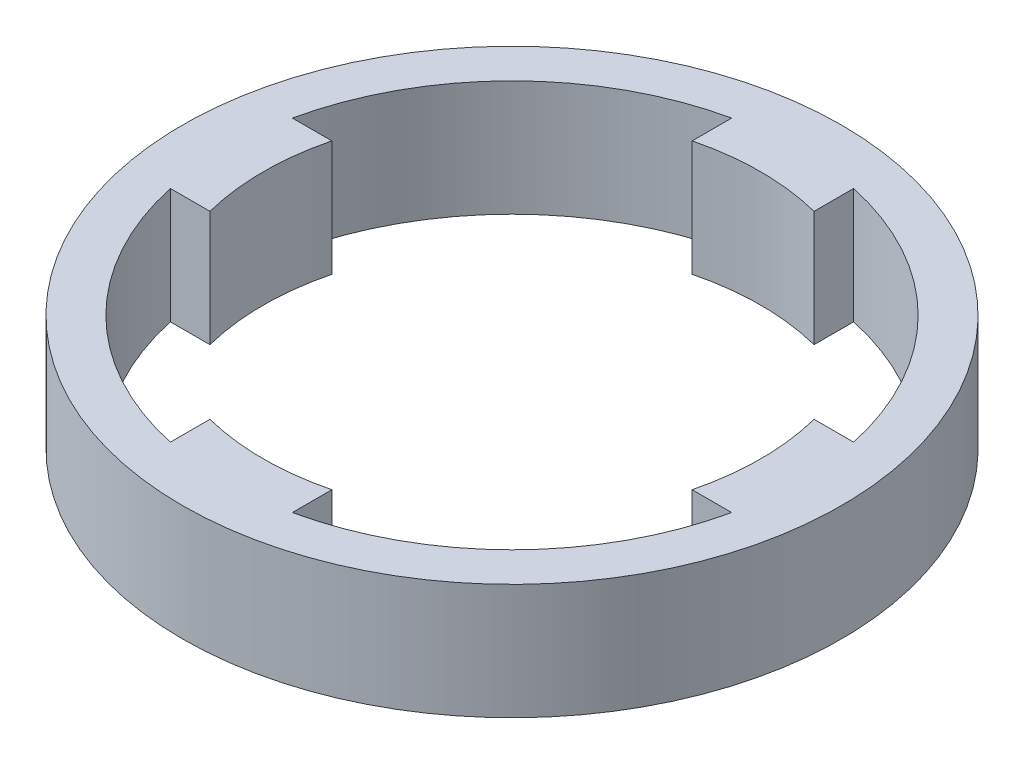
ISO-10303-21;
HEADER;
FILE_DESCRIPTION(('STEP AP214'),'2;1');
FILE_NAME('part.step','',(''),(''),'','','');
FILE_SCHEMA(('AUTOMOTIVE_DESIGN { 1 0 10303 214 1 1 1 1 }'));
ENDSEC;
DATA;
#1=APPLICATION_CONTEXT('core data for automotive mechanical design processes');
#2=APPLICATION_PROTOCOL_DEFINITION('international standard','automotive_design',2000,#1);
#3=PRODUCT_CONTEXT('',#1,'mechanical');
#4=PRODUCT('Part','Part','',(#3));
#5=PRODUCT_RELATED_PRODUCT_CATEGORY('part','',(#4));
#6=PRODUCT_DEFINITION_FORMATION('','',#4);
#7=PRODUCT_DEFINITION_CONTEXT('part definition',#1,'design');
#8=PRODUCT_DEFINITION('design','',#6,#7);
#9=PRODUCT_DEFINITION_SHAPE('','',#8);
#10=(LENGTH_UNIT() NAMED_UNIT(*) SI_UNIT(.MILLI.,.METRE.));
#11=(NAMED_UNIT(*) PLANE_ANGLE_UNIT() SI_UNIT($,.RADIAN.));
#12=(NAMED_UNIT(*) SI_UNIT($,.STERADIAN.) SOLID_ANGLE_UNIT());
#13=UNCERTAINTY_MEASURE_WITH_UNIT(LENGTH_MEASURE(1.E-05),#10,'distance_accuracy_value','');
#14=(GEOMETRIC_REPRESENTATION_CONTEXT(3) GLOBAL_UNCERTAINTY_ASSIGNED_CONTEXT((#13)) GLOBAL_UNIT_ASSIGNED_CONTEXT((#10,
#11,#12)) REPRESENTATION_CONTEXT('',''));
#15=CARTESIAN_POINT('',(0.,0.,0.));
#16=DIRECTION('',(0.,0.,1.));
#17=DIRECTION('',(1.,0.,0.));
#18=AXIS2_PLACEMENT_3D('',#15,#16,#17);
#19=CARTESIAN_POINT('',(0.,9.,0.));
#20=DIRECTION('',(0.,1.,0.));
#21=DIRECTION('',(0.,0.,1.));
#22=AXIS2_PLACEMENT_3D('',#19,#20,#21);
#23=PLANE('',#22);
#24=CARTESIAN_POINT('',(0.,9.,0.));
#25=DIRECTION('',(0.,1.,0.));
#26=DIRECTION('',(0.,0.,1.));
#27=AXIS2_PLACEMENT_3D('',#24,#25,#26);
#28=CIRCLE('',#27,25.675);
#29=CARTESIAN_POINT('',(0.,9.,25.675));
#30=VERTEX_POINT('',#29);
#31=EDGE_CURVE('E11',#30,#30,#28,.T.);
#32=ORIENTED_EDGE('',*,*,#31,.T.);
#33=EDGE_LOOP('',(#32));
#34=FACE_BOUND('',#33,.T.);
#35=DIRECTION('',(1.,0.,0.));
#36=VECTOR('',#35,1.);
#37=CARTESIAN_POINT('',(-21.8649977132402,9.,-4.75));
#38=LINE('',#37,#36);
#39=CARTESIAN_POINT('',(-21.8649977132402,9.,-4.75));
#40=VERTEX_POINT('',#39);
#41=CARTESIAN_POINT('',(-18.7837196795523,9.,-4.75));
#42=VERTEX_POINT('',#41);
#43=EDGE_CURVE('E155',#40,#42,#38,.T.);
#44=ORIENTED_EDGE('',*,*,#43,.F.);
#45=CARTESIAN_POINT('',(0.,9.,0.));
#46=DIRECTION('',(0.,1.,0.));
#47=DIRECTION('',(0.,0.,1.));
#48=AXIS2_PLACEMENT_3D('',#45,#46,#47);
#49=CIRCLE('',#48,22.375);
#50=CARTESIAN_POINT('',(-4.74999999999999,9.,-21.8649977132402));
#51=VERTEX_POINT('',#50);
#52=EDGE_CURVE('E147',#51,#40,#49,.T.);
#53=ORIENTED_EDGE('',*,*,#52,.F.);
#54=DIRECTION('',(0.,0.,-1.));
#55=VECTOR('',#54,1.);
#56=CARTESIAN_POINT('',(-4.74999999999999,9.,-21.8649977132402));
#57=LINE('',#56,#55);
#58=CARTESIAN_POINT('',(-4.74999999999999,9.,-18.7837196795523));
#59=VERTEX_POINT('',#58);
#60=EDGE_CURVE('E195',#59,#51,#57,.T.);
#61=ORIENTED_EDGE('',*,*,#60,.F.);
#62=CARTESIAN_POINT('',(0.,9.,0.));
#63=DIRECTION('',(0.,1.,0.));
#64=DIRECTION('',(0.,0.,1.));
#65=AXIS2_PLACEMENT_3D('',#62,#63,#64);
#66=CIRCLE('',#65,19.375);
#67=CARTESIAN_POINT('',(4.75,9.,-18.7837196795523));
#68=VERTEX_POINT('',#67);
#69=EDGE_CURVE('E193',#68,#59,#66,.T.);
#70=ORIENTED_EDGE('',*,*,#69,.F.);
#71=DIRECTION('',(0.,0.,1.));
#72=VECTOR('',#71,1.);
#73=CARTESIAN_POINT('',(4.75,9.,-21.8649977132402));
#74=LINE('',#73,#72);
#75=CARTESIAN_POINT('',(4.75,9.,-21.8649977132402));
#76=VERTEX_POINT('',#75);
#77=EDGE_CURVE('E191',#76,#68,#74,.T.);
#78=ORIENTED_EDGE('',*,*,#77,.F.);
#79=CARTESIAN_POINT('',(0.,9.,0.));
#80=DIRECTION('',(0.,1.,0.));
#81=DIRECTION('',(0.,0.,1.));
#82=AXIS2_PLACEMENT_3D('',#79,#80,#81);
#83=CIRCLE('',#82,22.375);
#84=CARTESIAN_POINT('',(21.8649977132402,9.,-4.75));
#85=VERTEX_POINT('',#84);
#86=EDGE_CURVE('E189',#85,#76,#83,.T.);
#87=ORIENTED_EDGE('',*,*,#86,.F.);
#88=DIRECTION('',(1.,0.,0.));
#89=VECTOR('',#88,1.);
#90=CARTESIAN_POINT('',(18.7837196795523,9.,-4.75));
#91=LINE('',#90,#89);
#92=CARTESIAN_POINT('',(18.7837196795523,9.,-4.75));
#93=VERTEX_POINT('',#92);
#94=EDGE_CURVE('E187',#93,#85,#91,.T.);
#95=ORIENTED_EDGE('',*,*,#94,.F.);
#96=CARTESIAN_POINT('',(0.,9.,0.));
#97=DIRECTION('',(0.,1.,0.));
#98=DIRECTION('',(0.,0.,1.));
#99=AXIS2_PLACEMENT_3D('',#96,#97,#98);
#100=CIRCLE('',#99,19.375);
#101=CARTESIAN_POINT('',(18.7837196795523,9.,4.75));
#102=VERTEX_POINT('',#101);
#103=EDGE_CURVE('E185',#102,#93,#100,.T.);
#104=ORIENTED_EDGE('',*,*,#103,.F.);
#105=DIRECTION('',(-1.,0.,0.));
#106=VECTOR('',#105,1.);
#107=CARTESIAN_POINT('',(21.8649977132402,9.,4.75));
#108=LINE('',#107,#106);
#109=CARTESIAN_POINT('',(21.8649977132402,9.,4.75));
#110=VERTEX_POINT('',#109);
#111=EDGE_CURVE('E183',#110,#102,#108,.T.);
#112=ORIENTED_EDGE('',*,*,#111,.F.);
#113=CARTESIAN_POINT('',(0.,9.,0.));
#114=DIRECTION('',(0.,1.,0.));
#115=DIRECTION('',(0.,0.,1.));
#116=AXIS2_PLACEMENT_3D('',#113,#114,#115);
#117=CIRCLE('',#116,22.375);
#118=CARTESIAN_POINT('',(4.75,9.,21.8649977132402));
#119=VERTEX_POINT('',#118);
#120=EDGE_CURVE('E181',#119,#110,#117,.T.);
#121=ORIENTED_EDGE('',*,*,#120,.F.);
#122=DIRECTION('',(0.,0.,1.));
#123=VECTOR('',#122,1.);
#124=CARTESIAN_POINT('',(4.75,9.,18.7837196795523));
#125=LINE('',#124,#123);
#126=CARTESIAN_POINT('',(4.75,9.,18.7837196795523));
#127=VERTEX_POINT('',#126);
#128=EDGE_CURVE('E179',#127,#119,#125,.T.);
#129=ORIENTED_EDGE('',*,*,#128,.F.);
#130=CARTESIAN_POINT('',(0.,9.,0.));
#131=DIRECTION('',(0.,1.,0.));
#132=DIRECTION('',(0.,0.,1.));
#133=AXIS2_PLACEMENT_3D('',#130,#131,#132);
#134=CIRCLE('',#133,19.375);
#135=CARTESIAN_POINT('',(-4.75000000000001,9.,18.7837196795523));
#136=VERTEX_POINT('',#135);
#137=EDGE_CURVE('E177',#136,#127,#134,.T.);
#138=ORIENTED_EDGE('',*,*,#137,.F.);
#139=DIRECTION('',(0.,0.,-1.));
#140=VECTOR('',#139,1.);
#141=CARTESIAN_POINT('',(-4.75,9.,21.8649977132402));
#142=LINE('',#141,#140);
#143=CARTESIAN_POINT('',(-4.75,9.,21.8649977132402));
#144=VERTEX_POINT('',#143);
#145=EDGE_CURVE('E175',#144,#136,#142,.T.);
#146=ORIENTED_EDGE('',*,*,#145,.F.);
#147=CARTESIAN_POINT('',(0.,9.,0.));
#148=DIRECTION('',(0.,1.,0.));
#149=DIRECTION('',(0.,0.,1.));
#150=AXIS2_PLACEMENT_3D('',#147,#148,#149);
#151=CIRCLE('',#150,22.375);
#152=CARTESIAN_POINT('',(-21.8649977132402,9.,4.75));
#153=VERTEX_POINT('',#152);
#154=EDGE_CURVE('E173',#153,#144,#151,.T.);
#155=ORIENTED_EDGE('',*,*,#154,.F.);
#156=DIRECTION('',(-1.,0.,0.));
#157=VECTOR('',#156,1.);
#158=CARTESIAN_POINT('',(-18.7837196795523,9.,4.75));
#159=LINE('',#158,#157);
#160=CARTESIAN_POINT('',(-18.7837196795523,9.,4.75));
#161=VERTEX_POINT('',#160);
#162=EDGE_CURVE('E169',#161,#153,#159,.T.);
#163=ORIENTED_EDGE('',*,*,#162,.F.);
#164=CARTESIAN_POINT('',(0.,9.,0.));
#165=DIRECTION('',(0.,1.,0.));
#166=DIRECTION('',(0.,0.,1.));
#167=AXIS2_PLACEMENT_3D('',#164,#165,#166);
#168=CIRCLE('',#167,19.375);
#169=EDGE_CURVE('E167',#42,#161,#168,.T.);
#170=ORIENTED_EDGE('',*,*,#169,.F.);
#171=EDGE_LOOP('',(#44,#53,#61,#70,#78,#87,#95,#104,#112,#121,#129,#138,#146,#155,#163,#170));
#172=FACE_BOUND('',#171,.T.);
#173=ADVANCED_FACE('F34',(#34,#172),#23,.T.);
#174=CARTESIAN_POINT('',(0.,0.,0.));
#175=DIRECTION('',(0.,1.,0.));
#176=DIRECTION('',(0.,0.,1.));
#177=AXIS2_PLACEMENT_3D('',#174,#175,#176);
#178=PLANE('',#177);
#179=CARTESIAN_POINT('',(0.,0.,0.));
#180=DIRECTION('',(0.,1.,0.));
#181=DIRECTION('',(0.,0.,1.));
#182=AXIS2_PLACEMENT_3D('',#179,#180,#181);
#183=CIRCLE('',#182,25.675);
#184=CARTESIAN_POINT('',(0.,0.,25.675));
#185=VERTEX_POINT('',#184);
#186=EDGE_CURVE('E38',#185,#185,#183,.T.);
#187=ORIENTED_EDGE('',*,*,#186,.F.);
#188=EDGE_LOOP('',(#187));
#189=FACE_BOUND('',#188,.T.);
#190=CARTESIAN_POINT('',(0.,0.,0.));
#191=DIRECTION('',(0.,1.,0.));
#192=DIRECTION('',(0.,0.,1.));
#193=AXIS2_PLACEMENT_3D('',#190,#191,#192);
#194=CIRCLE('',#193,22.375);
#195=CARTESIAN_POINT('',(-4.74999999999999,0.,-21.8649977132402));
#196=VERTEX_POINT('',#195);
#197=CARTESIAN_POINT('',(-21.8649977132402,0.,-4.75));
#198=VERTEX_POINT('',#197);
#199=EDGE_CURVE('E57',#196,#198,#194,.T.);
#200=ORIENTED_EDGE('',*,*,#199,.T.);
#201=DIRECTION('',(1.,0.,0.));
#202=VECTOR('',#201,1.);
#203=CARTESIAN_POINT('',(-21.8649977132402,0.,-4.75));
#204=LINE('',#203,#202);
#205=CARTESIAN_POINT('',(-18.7837196795523,0.,-4.75));
#206=VERTEX_POINT('',#205);
#207=EDGE_CURVE('E162',#198,#206,#204,.T.);
#208=ORIENTED_EDGE('',*,*,#207,.T.);
#209=CARTESIAN_POINT('',(0.,0.,0.));
#210=DIRECTION('',(0.,1.,0.));
#211=DIRECTION('',(0.,0.,1.));
#212=AXIS2_PLACEMENT_3D('',#209,#210,#211);
#213=CIRCLE('',#212,19.375);
#214=CARTESIAN_POINT('',(-18.7837196795523,0.,4.75));
#215=VERTEX_POINT('',#214);
#216=EDGE_CURVE('E199',#206,#215,#213,.T.);
#217=ORIENTED_EDGE('',*,*,#216,.T.);
#218=DIRECTION('',(-1.,0.,0.));
#219=VECTOR('',#218,1.);
#220=CARTESIAN_POINT('',(-18.7837196795523,0.,4.75));
#221=LINE('',#220,#219);
#222=CARTESIAN_POINT('',(-21.8649977132402,0.,4.75));
#223=VERTEX_POINT('',#222);
#224=EDGE_CURVE('E202',#215,#223,#221,.T.);
#225=ORIENTED_EDGE('',*,*,#224,.T.);
#226=CARTESIAN_POINT('',(0.,0.,0.));
#227=DIRECTION('',(0.,1.,0.));
#228=DIRECTION('',(0.,0.,1.));
#229=AXIS2_PLACEMENT_3D('',#226,#227,#228);
#230=CIRCLE('',#229,22.375);
#231=CARTESIAN_POINT('',(-4.75,0.,21.8649977132402));
#232=VERTEX_POINT('',#231);
#233=EDGE_CURVE('E205',#223,#232,#230,.T.);
#234=ORIENTED_EDGE('',*,*,#233,.T.);
#235=DIRECTION('',(0.,0.,-1.));
#236=VECTOR('',#235,1.);
#237=CARTESIAN_POINT('',(-4.75,0.,21.8649977132402));
#238=LINE('',#237,#236);
#239=CARTESIAN_POINT('',(-4.75000000000001,0.,18.7837196795523));
#240=VERTEX_POINT('',#239);
#241=EDGE_CURVE('E208',#232,#240,#238,.T.);
#242=ORIENTED_EDGE('',*,*,#241,.T.);
#243=CARTESIAN_POINT('',(0.,0.,0.));
#244=DIRECTION('',(0.,1.,0.));
#245=DIRECTION('',(0.,0.,1.));
#246=AXIS2_PLACEMENT_3D('',#243,#244,#245);
#247=CIRCLE('',#246,19.375);
#248=CARTESIAN_POINT('',(4.75,0.,18.7837196795523));
#249=VERTEX_POINT('',#248);
#250=EDGE_CURVE('E211',#240,#249,#247,.T.);
#251=ORIENTED_EDGE('',*,*,#250,.T.);
#252=DIRECTION('',(0.,0.,1.));
#253=VECTOR('',#252,1.);
#254=CARTESIAN_POINT('',(4.75,0.,18.7837196795523));
#255=LINE('',#254,#253);
#256=CARTESIAN_POINT('',(4.75,0.,21.8649977132402));
#257=VERTEX_POINT('',#256);
#258=EDGE_CURVE('E214',#249,#257,#255,.T.);
#259=ORIENTED_EDGE('',*,*,#258,.T.);
#260=CARTESIAN_POINT('',(0.,0.,0.));
#261=DIRECTION('',(0.,1.,0.));
#262=DIRECTION('',(0.,0.,1.));
#263=AXIS2_PLACEMENT_3D('',#260,#261,#262);
#264=CIRCLE('',#263,22.375);
#265=CARTESIAN_POINT('',(21.8649977132402,0.,4.75));
#266=VERTEX_POINT('',#265);
#267=EDGE_CURVE('E217',#257,#266,#264,.T.);
#268=ORIENTED_EDGE('',*,*,#267,.T.);
#269=DIRECTION('',(-1.,0.,0.));
#270=VECTOR('',#269,1.);
#271=CARTESIAN_POINT('',(21.8649977132402,0.,4.75));
#272=LINE('',#271,#270);
#273=CARTESIAN_POINT('',(18.7837196795523,0.,4.75));
#274=VERTEX_POINT('',#273);
#275=EDGE_CURVE('E220',#266,#274,#272,.T.);
#276=ORIENTED_EDGE('',*,*,#275,.T.);
#277=CARTESIAN_POINT('',(0.,0.,0.));
#278=DIRECTION('',(0.,1.,0.));
#279=DIRECTION('',(0.,0.,1.));
#280=AXIS2_PLACEMENT_3D('',#277,#278,#279);
#281=CIRCLE('',#280,19.375);
#282=CARTESIAN_POINT('',(18.7837196795523,0.,-4.75));
#283=VERTEX_POINT('',#282);
#284=EDGE_CURVE('E223',#274,#283,#281,.T.);
#285=ORIENTED_EDGE('',*,*,#284,.T.);
#286=DIRECTION('',(1.,0.,0.));
#287=VECTOR('',#286,1.);
#288=CARTESIAN_POINT('',(18.7837196795523,0.,-4.75));
#289=LINE('',#288,#287);
#290=CARTESIAN_POINT('',(21.8649977132402,0.,-4.75));
#291=VERTEX_POINT('',#290);
#292=EDGE_CURVE('E226',#283,#291,#289,.T.);
#293=ORIENTED_EDGE('',*,*,#292,.T.);
#294=CARTESIAN_POINT('',(0.,0.,0.));
#295=DIRECTION('',(0.,1.,0.));
#296=DIRECTION('',(0.,0.,1.));
#297=AXIS2_PLACEMENT_3D('',#294,#295,#296);
#298=CIRCLE('',#297,22.375);
#299=CARTESIAN_POINT('',(4.75,0.,-21.8649977132402));
#300=VERTEX_POINT('',#299);
#301=EDGE_CURVE('E229',#291,#300,#298,.T.);
#302=ORIENTED_EDGE('',*,*,#301,.T.);
#303=DIRECTION('',(0.,0.,1.));
#304=VECTOR('',#303,1.);
#305=CARTESIAN_POINT('',(4.75,0.,-21.8649977132402));
#306=LINE('',#305,#304);
#307=CARTESIAN_POINT('',(4.75,0.,-18.7837196795523));
#308=VERTEX_POINT('',#307);
#309=EDGE_CURVE('E232',#300,#308,#306,.T.);
#310=ORIENTED_EDGE('',*,*,#309,.T.);
#311=CARTESIAN_POINT('',(0.,0.,0.));
#312=DIRECTION('',(0.,1.,0.));
#313=DIRECTION('',(0.,0.,1.));
#314=AXIS2_PLACEMENT_3D('',#311,#312,#313);
#315=CIRCLE('',#314,19.375);
#316=CARTESIAN_POINT('',(-4.74999999999999,0.,-18.7837196795523));
#317=VERTEX_POINT('',#316);
#318=EDGE_CURVE('E235',#308,#317,#315,.T.);
#319=ORIENTED_EDGE('',*,*,#318,.T.);
#320=DIRECTION('',(0.,0.,-1.));
#321=VECTOR('',#320,1.);
#322=CARTESIAN_POINT('',(-4.74999999999999,0.,-21.8649977132402));
#323=LINE('',#322,#321);
#324=EDGE_CURVE('E156',#317,#196,#323,.T.);
#325=ORIENTED_EDGE('',*,*,#324,.T.);
#326=EDGE_LOOP('',(#200,#208,#217,#225,#234,#242,#251,#259,#268,#276,#285,#293,#302,#310,#319,#325));
#327=FACE_BOUND('',#326,.T.);
#328=ADVANCED_FACE('F272',(#189,#327),#178,.F.);
#329=CARTESIAN_POINT('',(0.,9.,0.));
#330=DIRECTION('',(0.,-1.,0.));
#331=DIRECTION('',(0.,0.,-1.));
#332=AXIS2_PLACEMENT_3D('',#329,#330,#331);
#333=CYLINDRICAL_SURFACE('',#332,25.675);
#334=ORIENTED_EDGE('',*,*,#31,.F.);
#335=EDGE_LOOP('',(#334));
#336=FACE_BOUND('',#335,.T.);
#337=ORIENTED_EDGE('',*,*,#186,.T.);
#338=EDGE_LOOP('',(#337));
#339=FACE_BOUND('',#338,.T.);
#340=ADVANCED_FACE('F36',(#336,#339),#333,.T.);
#341=CARTESIAN_POINT('',(0.,9.,0.));
#342=DIRECTION('',(0.,-1.,0.));
#343=DIRECTION('',(0.,0.,-1.));
#344=AXIS2_PLACEMENT_3D('',#341,#342,#343);
#345=CYLINDRICAL_SURFACE('',#344,22.375);
#346=ORIENTED_EDGE('',*,*,#199,.F.);
#347=DIRECTION('',(0.,-1.,0.));
#348=VECTOR('',#347,1.);
#349=CARTESIAN_POINT('',(-4.74999999999999,9.,-21.8649977132402));
#350=LINE('',#349,#348);
#351=EDGE_CURVE('E151',#51,#196,#350,.T.);
#352=ORIENTED_EDGE('',*,*,#351,.F.);
#353=ORIENTED_EDGE('',*,*,#52,.T.);
#354=DIRECTION('',(0.,-1.,0.));
#355=VECTOR('',#354,1.);
#356=CARTESIAN_POINT('',(-21.8649977132402,9.,-4.75));
#357=LINE('',#356,#355);
#358=EDGE_CURVE('E150',#40,#198,#357,.T.);
#359=ORIENTED_EDGE('',*,*,#358,.T.);
#360=EDGE_LOOP('',(#346,#352,#353,#359));
#361=FACE_BOUND('',#360,.T.);
#362=ADVANCED_FACE('F149',(#361),#345,.F.);
#363=CARTESIAN_POINT('',(-21.8649977132402,9.,-4.75));
#364=DIRECTION('',(0.,0.,-1.));
#365=DIRECTION('',(-1.,0.,0.));
#366=AXIS2_PLACEMENT_3D('',#363,#364,#365);
#367=PLANE('',#366);
#368=ORIENTED_EDGE('',*,*,#207,.F.);
#369=ORIENTED_EDGE('',*,*,#358,.F.);
#370=ORIENTED_EDGE('',*,*,#43,.T.);
#371=DIRECTION('',(0.,-1.,0.));
#372=VECTOR('',#371,1.);
#373=CARTESIAN_POINT('',(-18.7837196795523,9.,-4.75));
#374=LINE('',#373,#372);
#375=EDGE_CURVE('E163',#42,#206,#374,.T.);
#376=ORIENTED_EDGE('',*,*,#375,.T.);
#377=EDGE_LOOP('',(#368,#369,#370,#376));
#378=FACE_BOUND('',#377,.T.);
#379=ADVANCED_FACE('F159',(#378),#367,.T.);
#380=CARTESIAN_POINT('',(0.,9.,0.));
#381=DIRECTION('',(0.,-1.,0.));
#382=DIRECTION('',(0.,0.,-1.));
#383=AXIS2_PLACEMENT_3D('',#380,#381,#382);
#384=CYLINDRICAL_SURFACE('',#383,19.375);
#385=ORIENTED_EDGE('',*,*,#216,.F.);
#386=ORIENTED_EDGE('',*,*,#375,.F.);
#387=ORIENTED_EDGE('',*,*,#169,.T.);
#388=DIRECTION('',(0.,-1.,0.));
#389=VECTOR('',#388,1.);
#390=CARTESIAN_POINT('',(-18.7837196795523,9.,4.75));
#391=LINE('',#390,#389);
#392=EDGE_CURVE('E264',#161,#215,#391,.T.);
#393=ORIENTED_EDGE('',*,*,#392,.T.);
#394=EDGE_LOOP('',(#385,#386,#387,#393));
#395=FACE_BOUND('',#394,.T.);
#396=ADVANCED_FACE('F268',(#395),#384,.F.);
#397=CARTESIAN_POINT('',(-18.7837196795523,9.,4.75));
#398=DIRECTION('',(0.,0.,1.));
#399=DIRECTION('',(1.,0.,0.));
#400=AXIS2_PLACEMENT_3D('',#397,#398,#399);
#401=PLANE('',#400);
#402=ORIENTED_EDGE('',*,*,#224,.F.);
#403=ORIENTED_EDGE('',*,*,#392,.F.);
#404=ORIENTED_EDGE('',*,*,#162,.T.);
#405=DIRECTION('',(0.,-1.,0.));
#406=VECTOR('',#405,1.);
#407=CARTESIAN_POINT('',(-21.8649977132402,9.,4.75));
#408=LINE('',#407,#406);
#409=EDGE_CURVE('E262',#153,#223,#408,.T.);
#410=ORIENTED_EDGE('',*,*,#409,.T.);
#411=EDGE_LOOP('',(#402,#403,#404,#410));
#412=FACE_BOUND('',#411,.T.);
#413=ADVANCED_FACE('F330',(#412),#401,.T.);
#414=CARTESIAN_POINT('',(0.,9.,0.));
#415=DIRECTION('',(0.,-1.,0.));
#416=DIRECTION('',(0.,0.,-1.));
#417=AXIS2_PLACEMENT_3D('',#414,#415,#416);
#418=CYLINDRICAL_SURFACE('',#417,22.375);
#419=ORIENTED_EDGE('',*,*,#233,.F.);
#420=ORIENTED_EDGE('',*,*,#409,.F.);
#421=ORIENTED_EDGE('',*,*,#154,.T.);
#422=DIRECTION('',(0.,-1.,0.));
#423=VECTOR('',#422,1.);
#424=CARTESIAN_POINT('',(-4.75,9.,21.8649977132402));
#425=LINE('',#424,#423);
#426=EDGE_CURVE('E260',#144,#232,#425,.T.);
#427=ORIENTED_EDGE('',*,*,#426,.T.);
#428=EDGE_LOOP('',(#419,#420,#421,#427));
#429=FACE_BOUND('',#428,.T.);
#430=ADVANCED_FACE('F327',(#429),#418,.F.);
#431=CARTESIAN_POINT('',(-4.75,9.,21.8649977132402));
#432=DIRECTION('',(-1.,0.,0.));
#433=DIRECTION('',(0.,0.,1.));
#434=AXIS2_PLACEMENT_3D('',#431,#432,#433);
#435=PLANE('',#434);
#436=ORIENTED_EDGE('',*,*,#241,.F.);
#437=ORIENTED_EDGE('',*,*,#426,.F.);
#438=ORIENTED_EDGE('',*,*,#145,.T.);
#439=DIRECTION('',(0.,-1.,0.));
#440=VECTOR('',#439,1.);
#441=CARTESIAN_POINT('',(-4.75000000000001,9.,18.7837196795523));
#442=LINE('',#441,#440);
#443=EDGE_CURVE('E258',#136,#240,#442,.T.);
#444=ORIENTED_EDGE('',*,*,#443,.T.);
#445=EDGE_LOOP('',(#436,#437,#438,#444));
#446=FACE_BOUND('',#445,.T.);
#447=ADVANCED_FACE('F324',(#446),#435,.T.);
#448=CARTESIAN_POINT('',(0.,9.,0.));
#449=DIRECTION('',(0.,-1.,0.));
#450=DIRECTION('',(0.,0.,-1.));
#451=AXIS2_PLACEMENT_3D('',#448,#449,#450);
#452=CYLINDRICAL_SURFACE('',#451,19.375);
#453=ORIENTED_EDGE('',*,*,#250,.F.);
#454=ORIENTED_EDGE('',*,*,#443,.F.);
#455=ORIENTED_EDGE('',*,*,#137,.T.);
#456=DIRECTION('',(0.,-1.,0.));
#457=VECTOR('',#456,1.);
#458=CARTESIAN_POINT('',(4.75,9.,18.7837196795523));
#459=LINE('',#458,#457);
#460=EDGE_CURVE('E256',#127,#249,#459,.T.);
#461=ORIENTED_EDGE('',*,*,#460,.T.);
#462=EDGE_LOOP('',(#453,#454,#455,#461));
#463=FACE_BOUND('',#462,.T.);
#464=ADVANCED_FACE('F317',(#463),#452,.F.);
#465=CARTESIAN_POINT('',(4.75,9.,18.7837196795523));
#466=DIRECTION('',(1.,0.,0.));
#467=DIRECTION('',(0.,0.,-1.));
#468=AXIS2_PLACEMENT_3D('',#465,#466,#467);
#469=PLANE('',#468);
#470=ORIENTED_EDGE('',*,*,#258,.F.);
#471=ORIENTED_EDGE('',*,*,#460,.F.);
#472=ORIENTED_EDGE('',*,*,#128,.T.);
#473=DIRECTION('',(0.,-1.,0.));
#474=VECTOR('',#473,1.);
#475=CARTESIAN_POINT('',(4.75,9.,21.8649977132402));
#476=LINE('',#475,#474);
#477=EDGE_CURVE('E254',#119,#257,#476,.T.);
#478=ORIENTED_EDGE('',*,*,#477,.T.);
#479=EDGE_LOOP('',(#470,#471,#472,#478));
#480=FACE_BOUND('',#479,.T.);
#481=ADVANCED_FACE('F313',(#480),#469,.T.);
#482=CARTESIAN_POINT('',(0.,9.,0.));
#483=DIRECTION('',(0.,-1.,0.));
#484=DIRECTION('',(0.,0.,-1.));
#485=AXIS2_PLACEMENT_3D('',#482,#483,#484);
#486=CYLINDRICAL_SURFACE('',#485,22.375);
#487=ORIENTED_EDGE('',*,*,#267,.F.);
#488=ORIENTED_EDGE('',*,*,#477,.F.);
#489=ORIENTED_EDGE('',*,*,#120,.T.);
#490=DIRECTION('',(0.,-1.,0.));
#491=VECTOR('',#490,1.);
#492=CARTESIAN_POINT('',(21.8649977132402,9.,4.75));
#493=LINE('',#492,#491);
#494=EDGE_CURVE('E252',#110,#266,#493,.T.);
#495=ORIENTED_EDGE('',*,*,#494,.T.);
#496=EDGE_LOOP('',(#487,#488,#489,#495));
#497=FACE_BOUND('',#496,.T.);
#498=ADVANCED_FACE('F310',(#497),#486,.F.);
#499=CARTESIAN_POINT('',(21.8649977132402,9.,4.75));
#500=DIRECTION('',(0.,0.,1.));
#501=DIRECTION('',(1.,0.,0.));
#502=AXIS2_PLACEMENT_3D('',#499,#500,#501);
#503=PLANE('',#502);
#504=ORIENTED_EDGE('',*,*,#275,.F.);
#505=ORIENTED_EDGE('',*,*,#494,.F.);
#506=ORIENTED_EDGE('',*,*,#111,.T.);
#507=DIRECTION('',(0.,-1.,0.));
#508=VECTOR('',#507,1.);
#509=CARTESIAN_POINT('',(18.7837196795523,9.,4.75));
#510=LINE('',#509,#508);
#511=EDGE_CURVE('E250',#102,#274,#510,.T.);
#512=ORIENTED_EDGE('',*,*,#511,.T.);
#513=EDGE_LOOP('',(#504,#505,#506,#512));
#514=FACE_BOUND('',#513,.T.);
#515=ADVANCED_FACE('F302',(#514),#503,.T.);
#516=CARTESIAN_POINT('',(0.,9.,0.));
#517=DIRECTION('',(0.,-1.,0.));
#518=DIRECTION('',(0.,0.,-1.));
#519=AXIS2_PLACEMENT_3D('',#516,#517,#518);
#520=CYLINDRICAL_SURFACE('',#519,19.375);
#521=ORIENTED_EDGE('',*,*,#284,.F.);
#522=ORIENTED_EDGE('',*,*,#511,.F.);
#523=ORIENTED_EDGE('',*,*,#103,.T.);
#524=DIRECTION('',(0.,-1.,0.));
#525=VECTOR('',#524,1.);
#526=CARTESIAN_POINT('',(18.7837196795523,9.,-4.75));
#527=LINE('',#526,#525);
#528=EDGE_CURVE('E248',#93,#283,#527,.T.);
#529=ORIENTED_EDGE('',*,*,#528,.T.);
#530=EDGE_LOOP('',(#521,#522,#523,#529));
#531=FACE_BOUND('',#530,.T.);
#532=ADVANCED_FACE('F298',(#531),#520,.F.);
#533=CARTESIAN_POINT('',(18.7837196795523,9.,-4.75));
#534=DIRECTION('',(0.,0.,-1.));
#535=DIRECTION('',(-1.,0.,0.));
#536=AXIS2_PLACEMENT_3D('',#533,#534,#535);
#537=PLANE('',#536);
#538=ORIENTED_EDGE('',*,*,#292,.F.);
#539=ORIENTED_EDGE('',*,*,#528,.F.);
#540=ORIENTED_EDGE('',*,*,#94,.T.);
#541=DIRECTION('',(0.,-1.,0.));
#542=VECTOR('',#541,1.);
#543=CARTESIAN_POINT('',(21.8649977132402,9.,-4.75));
#544=LINE('',#543,#542);
#545=EDGE_CURVE('E246',#85,#291,#544,.T.);
#546=ORIENTED_EDGE('',*,*,#545,.T.);
#547=EDGE_LOOP('',(#538,#539,#540,#546));
#548=FACE_BOUND('',#547,.T.);
#549=ADVANCED_FACE('F295',(#548),#537,.T.);
#550=CARTESIAN_POINT('',(0.,9.,0.));
#551=DIRECTION('',(0.,-1.,0.));
#552=DIRECTION('',(0.,0.,-1.));
#553=AXIS2_PLACEMENT_3D('',#550,#551,#552);
#554=CYLINDRICAL_SURFACE('',#553,22.375);
#555=ORIENTED_EDGE('',*,*,#301,.F.);
#556=ORIENTED_EDGE('',*,*,#545,.F.);
#557=ORIENTED_EDGE('',*,*,#86,.T.);
#558=DIRECTION('',(0.,-1.,0.));
#559=VECTOR('',#558,1.);
#560=CARTESIAN_POINT('',(4.75,9.,-21.8649977132402));
#561=LINE('',#560,#559);
#562=EDGE_CURVE('E244',#76,#300,#561,.T.);
#563=ORIENTED_EDGE('',*,*,#562,.T.);
#564=EDGE_LOOP('',(#555,#556,#557,#563));
#565=FACE_BOUND('',#564,.T.);
#566=ADVANCED_FACE('F287',(#565),#554,.F.);
#567=CARTESIAN_POINT('',(4.75,9.,-21.8649977132402));
#568=DIRECTION('',(1.,0.,0.));
#569=DIRECTION('',(0.,0.,-1.));
#570=AXIS2_PLACEMENT_3D('',#567,#568,#569);
#571=PLANE('',#570);
#572=ORIENTED_EDGE('',*,*,#309,.F.);
#573=ORIENTED_EDGE('',*,*,#562,.F.);
#574=ORIENTED_EDGE('',*,*,#77,.T.);
#575=DIRECTION('',(0.,-1.,0.));
#576=VECTOR('',#575,1.);
#577=CARTESIAN_POINT('',(4.75,9.,-18.7837196795523));
#578=LINE('',#577,#576);
#579=EDGE_CURVE('E242',#68,#308,#578,.T.);
#580=ORIENTED_EDGE('',*,*,#579,.T.);
#581=EDGE_LOOP('',(#572,#573,#574,#580));
#582=FACE_BOUND('',#581,.T.);
#583=ADVANCED_FACE('F283',(#582),#571,.T.);
#584=CARTESIAN_POINT('',(0.,9.,0.));
#585=DIRECTION('',(0.,-1.,0.));
#586=DIRECTION('',(0.,0.,-1.));
#587=AXIS2_PLACEMENT_3D('',#584,#585,#586);
#588=CYLINDRICAL_SURFACE('',#587,19.375);
#589=ORIENTED_EDGE('',*,*,#318,.F.);
#590=ORIENTED_EDGE('',*,*,#579,.F.);
#591=ORIENTED_EDGE('',*,*,#69,.T.);
#592=DIRECTION('',(0.,-1.,0.));
#593=VECTOR('',#592,1.);
#594=CARTESIAN_POINT('',(-4.74999999999999,9.,-18.7837196795523));
#595=LINE('',#594,#593);
#596=EDGE_CURVE('E49',#59,#317,#595,.T.);
#597=ORIENTED_EDGE('',*,*,#596,.T.);
#598=EDGE_LOOP('',(#589,#590,#591,#597));
#599=FACE_BOUND('',#598,.T.);
#600=ADVANCED_FACE('F280',(#599),#588,.F.);
#601=CARTESIAN_POINT('',(-4.74999999999999,9.,-21.8649977132402));
#602=DIRECTION('',(-1.,0.,0.));
#603=DIRECTION('',(0.,0.,1.));
#604=AXIS2_PLACEMENT_3D('',#601,#602,#603);
#605=PLANE('',#604);
#606=ORIENTED_EDGE('',*,*,#324,.F.);
#607=ORIENTED_EDGE('',*,*,#596,.F.);
#608=ORIENTED_EDGE('',*,*,#60,.T.);
#609=ORIENTED_EDGE('',*,*,#351,.T.);
#610=EDGE_LOOP('',(#606,#607,#608,#609));
#611=FACE_BOUND('',#610,.T.);
#612=ADVANCED_FACE('F274',(#611),#605,.T.);
#613=CLOSED_SHELL('',(#173,#328,#340,#362,#379,#396,#413,#430,#447,#464,#481,#498,#515,#532,
#549,#566,#583,#600,#612));
#614=MANIFOLD_SOLID_BREP('B2',#613);
#615=ADVANCED_BREP_SHAPE_REPRESENTATION('',(#18,#614),#14);
#616=SHAPE_DEFINITION_REPRESENTATION(#9,#615);
ENDSEC;
END-ISO-10303-21;
